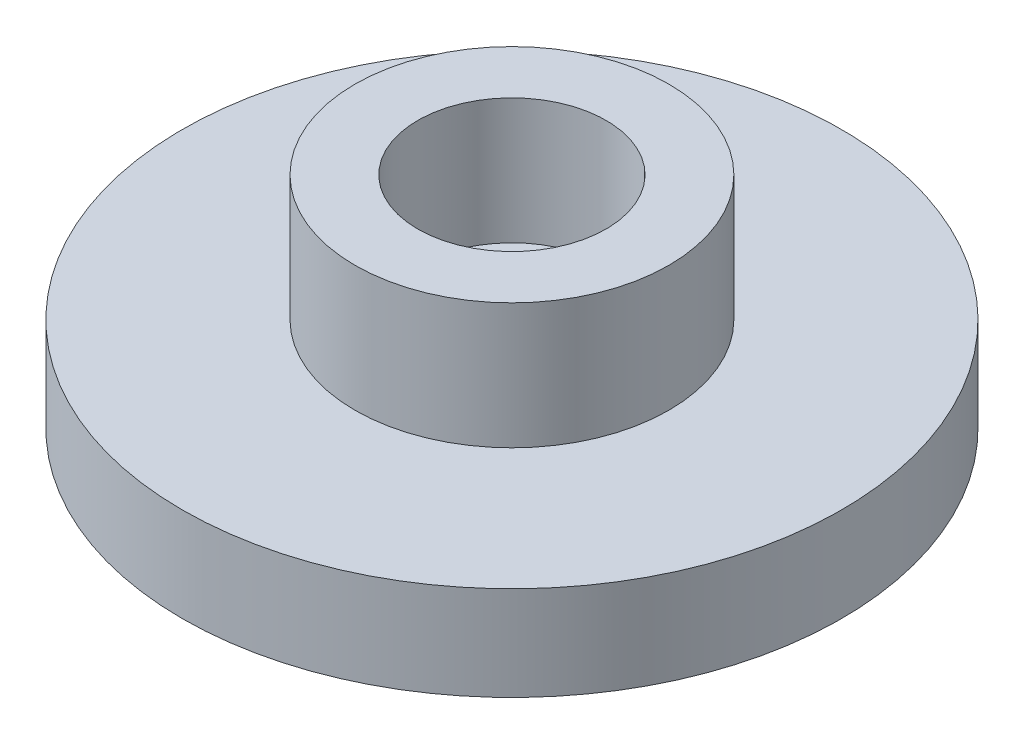
ISO-10303-21;
HEADER;
FILE_DESCRIPTION(('STEP AP214'),'2;1');
FILE_NAME('part.step','',(''),(''),'','','');
FILE_SCHEMA(('AUTOMOTIVE_DESIGN { 1 0 10303 214 1 1 1 1 }'));
ENDSEC;
DATA;
#1=APPLICATION_CONTEXT('core data for automotive mechanical design processes');
#2=APPLICATION_PROTOCOL_DEFINITION('international standard','automotive_design',2000,#1);
#3=PRODUCT_CONTEXT('',#1,'mechanical');
#4=PRODUCT('Part','Part','',(#3));
#5=PRODUCT_RELATED_PRODUCT_CATEGORY('part','',(#4));
#6=PRODUCT_DEFINITION_FORMATION('','',#4);
#7=PRODUCT_DEFINITION_CONTEXT('part definition',#1,'design');
#8=PRODUCT_DEFINITION('design','',#6,#7);
#9=PRODUCT_DEFINITION_SHAPE('','',#8);
#10=(LENGTH_UNIT() NAMED_UNIT(*) SI_UNIT(.MILLI.,.METRE.));
#11=(NAMED_UNIT(*) PLANE_ANGLE_UNIT() SI_UNIT($,.RADIAN.));
#12=(NAMED_UNIT(*) SI_UNIT($,.STERADIAN.) SOLID_ANGLE_UNIT());
#13=UNCERTAINTY_MEASURE_WITH_UNIT(LENGTH_MEASURE(1.E-05),#10,'distance_accuracy_value','');
#14=(GEOMETRIC_REPRESENTATION_CONTEXT(3) GLOBAL_UNCERTAINTY_ASSIGNED_CONTEXT((#13)) GLOBAL_UNIT_ASSIGNED_CONTEXT((#10,
#11,#12)) REPRESENTATION_CONTEXT('',''));
#15=CARTESIAN_POINT('',(0.,0.,0.));
#16=DIRECTION('',(0.,0.,1.));
#17=DIRECTION('',(1.,0.,0.));
#18=AXIS2_PLACEMENT_3D('',#15,#16,#17);
#19=CARTESIAN_POINT('',(0.,3.,0.));
#20=DIRECTION('',(0.,-1.,0.));
#21=DIRECTION('',(0.,0.,-1.));
#22=AXIS2_PLACEMENT_3D('',#19,#20,#21);
#23=CYLINDRICAL_SURFACE('',#22,10.5);
#24=CARTESIAN_POINT('',(0.,3.,0.));
#25=DIRECTION('',(0.,1.,0.));
#26=DIRECTION('',(0.,0.,1.));
#27=AXIS2_PLACEMENT_3D('',#24,#25,#26);
#28=CIRCLE('',#27,10.5);
#29=CARTESIAN_POINT('',(0.,3.,10.5));
#30=VERTEX_POINT('',#29);
#31=EDGE_CURVE('E10',#30,#30,#28,.T.);
#32=ORIENTED_EDGE('',*,*,#31,.F.);
#33=EDGE_LOOP('',(#32));
#34=FACE_BOUND('',#33,.T.);
#35=CARTESIAN_POINT('',(0.,0.,0.));
#36=DIRECTION('',(0.,1.,0.));
#37=DIRECTION('',(0.,0.,1.));
#38=AXIS2_PLACEMENT_3D('',#35,#36,#37);
#39=CIRCLE('',#38,10.5);
#40=CARTESIAN_POINT('',(0.,0.,10.5));
#41=VERTEX_POINT('',#40);
#42=EDGE_CURVE('E36',#41,#41,#39,.T.);
#43=ORIENTED_EDGE('',*,*,#42,.T.);
#44=EDGE_LOOP('',(#43));
#45=FACE_BOUND('',#44,.T.);
#46=ADVANCED_FACE('F33',(#34,#45),#23,.T.);
#47=CARTESIAN_POINT('',(0.,3.,0.));
#48=DIRECTION('',(0.,1.,0.));
#49=DIRECTION('',(0.,0.,1.));
#50=AXIS2_PLACEMENT_3D('',#47,#48,#49);
#51=PLANE('',#50);
#52=CARTESIAN_POINT('',(0.,3.,0.));
#53=DIRECTION('',(0.,1.,0.));
#54=DIRECTION('',(0.,0.,1.));
#55=AXIS2_PLACEMENT_3D('',#52,#53,#54);
#56=CIRCLE('',#55,5.);
#57=CARTESIAN_POINT('',(0.,3.,5.));
#58=VERTEX_POINT('',#57);
#59=EDGE_CURVE('E45',#58,#58,#56,.T.);
#60=ORIENTED_EDGE('',*,*,#59,.F.);
#61=EDGE_LOOP('',(#60));
#62=FACE_BOUND('',#61,.T.);
#63=ORIENTED_EDGE('',*,*,#31,.T.);
#64=EDGE_LOOP('',(#63));
#65=FACE_BOUND('',#64,.T.);
#66=ADVANCED_FACE('F78',(#62,#65),#51,.T.);
#67=CARTESIAN_POINT('',(0.,0.,0.));
#68=DIRECTION('',(0.,1.,0.));
#69=DIRECTION('',(0.,0.,1.));
#70=AXIS2_PLACEMENT_3D('',#67,#68,#69);
#71=PLANE('',#70);
#72=ORIENTED_EDGE('',*,*,#42,.F.);
#73=EDGE_LOOP('',(#72));
#74=FACE_BOUND('',#73,.T.);
#75=ADVANCED_FACE('F74',(#74),#71,.F.);
#76=CARTESIAN_POINT('',(0.,7.,0.));
#77=DIRECTION('',(0.,-1.,0.));
#78=DIRECTION('',(0.,0.,-1.));
#79=AXIS2_PLACEMENT_3D('',#76,#77,#78);
#80=CYLINDRICAL_SURFACE('',#79,5.);
#81=CARTESIAN_POINT('',(0.,7.,0.));
#82=DIRECTION('',(0.,1.,0.));
#83=DIRECTION('',(0.,0.,1.));
#84=AXIS2_PLACEMENT_3D('',#81,#82,#83);
#85=CIRCLE('',#84,5.);
#86=CARTESIAN_POINT('',(0.,7.,5.));
#87=VERTEX_POINT('',#86);
#88=EDGE_CURVE('E43',#87,#87,#85,.T.);
#89=ORIENTED_EDGE('',*,*,#88,.F.);
#90=EDGE_LOOP('',(#89));
#91=FACE_BOUND('',#90,.T.);
#92=ORIENTED_EDGE('',*,*,#59,.T.);
#93=EDGE_LOOP('',(#92));
#94=FACE_BOUND('',#93,.T.);
#95=ADVANCED_FACE('F68',(#91,#94),#80,.T.);
#96=CARTESIAN_POINT('',(0.,7.,0.));
#97=DIRECTION('',(0.,1.,0.));
#98=DIRECTION('',(0.,0.,1.));
#99=AXIS2_PLACEMENT_3D('',#96,#97,#98);
#100=PLANE('',#99);
#101=CARTESIAN_POINT('',(0.,7.,0.));
#102=DIRECTION('',(0.,1.,0.));
#103=DIRECTION('',(0.,0.,1.));
#104=AXIS2_PLACEMENT_3D('',#101,#102,#103);
#105=CIRCLE('',#104,3.);
#106=CARTESIAN_POINT('',(0.,7.,3.));
#107=VERTEX_POINT('',#106);
#108=EDGE_CURVE('E51',#107,#107,#105,.T.);
#109=ORIENTED_EDGE('',*,*,#108,.F.);
#110=EDGE_LOOP('',(#109));
#111=FACE_BOUND('',#110,.T.);
#112=ORIENTED_EDGE('',*,*,#88,.T.);
#113=EDGE_LOOP('',(#112));
#114=FACE_BOUND('',#113,.T.);
#115=ADVANCED_FACE('F62',(#111,#114),#100,.T.);
#116=CARTESIAN_POINT('',(0.,3.,0.));
#117=DIRECTION('',(0.,1.,0.));
#118=DIRECTION('',(0.,0.,1.));
#119=AXIS2_PLACEMENT_3D('',#116,#117,#118);
#120=CYLINDRICAL_SURFACE('',#119,3.);
#121=CARTESIAN_POINT('',(0.,3.,0.));
#122=DIRECTION('',(0.,1.,0.));
#123=DIRECTION('',(0.,0.,1.));
#124=AXIS2_PLACEMENT_3D('',#121,#122,#123);
#125=CIRCLE('',#124,3.);
#126=CARTESIAN_POINT('',(0.,3.,3.));
#127=VERTEX_POINT('',#126);
#128=EDGE_CURVE('E48',#127,#127,#125,.T.);
#129=ORIENTED_EDGE('',*,*,#128,.F.);
#130=EDGE_LOOP('',(#129));
#131=FACE_BOUND('',#130,.T.);
#132=ORIENTED_EDGE('',*,*,#108,.T.);
#133=EDGE_LOOP('',(#132));
#134=FACE_BOUND('',#133,.T.);
#135=ADVANCED_FACE('F59',(#131,#134),#120,.F.);
#136=CARTESIAN_POINT('',(0.,3.,0.));
#137=DIRECTION('',(0.,1.,0.));
#138=DIRECTION('',(0.,0.,1.));
#139=AXIS2_PLACEMENT_3D('',#136,#137,#138);
#140=PLANE('',#139);
#141=ORIENTED_EDGE('',*,*,#128,.T.);
#142=EDGE_LOOP('',(#141));
#143=FACE_BOUND('',#142,.T.);
#144=ADVANCED_FACE('F57',(#143),#140,.T.);
#145=CLOSED_SHELL('',(#46,#66,#75,#95,#115,#135,#144));
#146=MANIFOLD_SOLID_BREP('B2',#145);
#147=ADVANCED_BREP_SHAPE_REPRESENTATION('',(#18,#146),#14);
#148=SHAPE_DEFINITION_REPRESENTATION(#9,#147);
ENDSEC;
END-ISO-10303-21;
